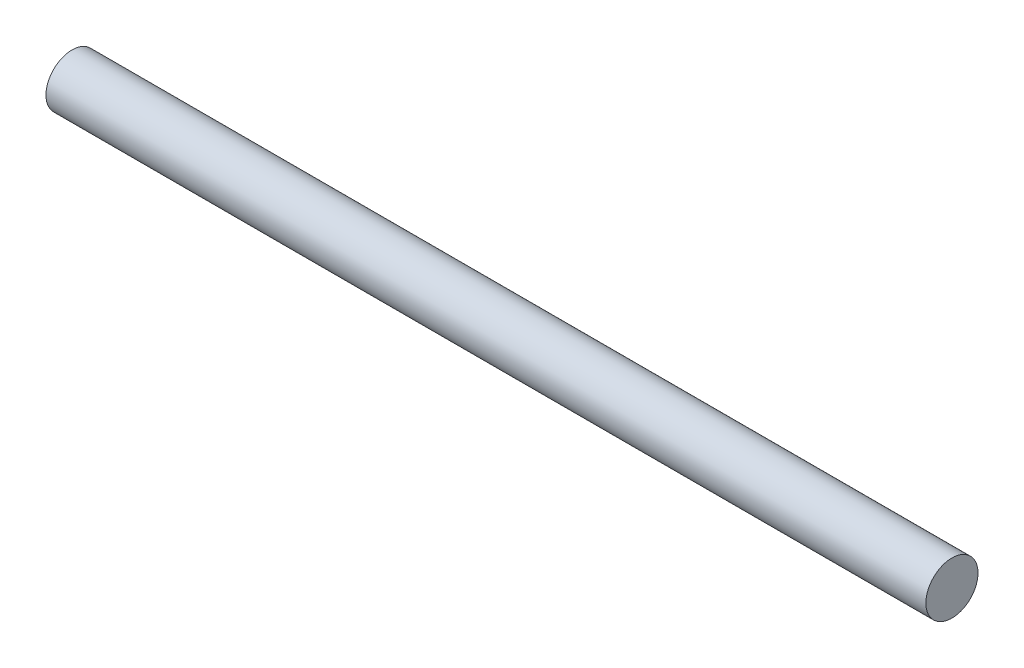
ISO-10303-21;
HEADER;
FILE_DESCRIPTION(('STEP AP214'),'2;1');
FILE_NAME('part.step','',(''),(''),'','','');
FILE_SCHEMA(('AUTOMOTIVE_DESIGN { 1 0 10303 214 1 1 1 1 }'));
ENDSEC;
DATA;
#1=APPLICATION_CONTEXT('core data for automotive mechanical design processes');
#2=APPLICATION_PROTOCOL_DEFINITION('international standard','automotive_design',2000,#1);
#3=PRODUCT_CONTEXT('',#1,'mechanical');
#4=PRODUCT('Part','Part','',(#3));
#5=PRODUCT_RELATED_PRODUCT_CATEGORY('part','',(#4));
#6=PRODUCT_DEFINITION_FORMATION('','',#4);
#7=PRODUCT_DEFINITION_CONTEXT('part definition',#1,'design');
#8=PRODUCT_DEFINITION('design','',#6,#7);
#9=PRODUCT_DEFINITION_SHAPE('','',#8);
#10=(LENGTH_UNIT() NAMED_UNIT(*) SI_UNIT(.MILLI.,.METRE.));
#11=(NAMED_UNIT(*) PLANE_ANGLE_UNIT() SI_UNIT($,.RADIAN.));
#12=(NAMED_UNIT(*) SI_UNIT($,.STERADIAN.) SOLID_ANGLE_UNIT());
#13=UNCERTAINTY_MEASURE_WITH_UNIT(LENGTH_MEASURE(1.E-05),#10,'distance_accuracy_value','');
#14=(GEOMETRIC_REPRESENTATION_CONTEXT(3) GLOBAL_UNCERTAINTY_ASSIGNED_CONTEXT((#13)) GLOBAL_UNIT_ASSIGNED_CONTEXT((#10,
#11,#12)) REPRESENTATION_CONTEXT('',''));
#15=CARTESIAN_POINT('',(0.,0.,0.));
#16=DIRECTION('',(0.,0.,1.));
#17=DIRECTION('',(1.,0.,0.));
#18=AXIS2_PLACEMENT_3D('',#15,#16,#17);
#19=CARTESIAN_POINT('',(135.,0.,0.));
#20=DIRECTION('',(-1.,0.,0.));
#21=DIRECTION('',(0.,0.,1.));
#22=AXIS2_PLACEMENT_3D('',#19,#20,#21);
#23=CYLINDRICAL_SURFACE('',#22,4.);
#24=CARTESIAN_POINT('',(135.,0.,0.));
#25=DIRECTION('',(1.,0.,0.));
#26=DIRECTION('',(0.,0.,-1.));
#27=AXIS2_PLACEMENT_3D('',#24,#25,#26);
#28=CIRCLE('',#27,4.);
#29=CARTESIAN_POINT('',(135.,0.,-4.));
#30=VERTEX_POINT('',#29);
#31=EDGE_CURVE('E10',#30,#30,#28,.T.);
#32=ORIENTED_EDGE('',*,*,#31,.F.);
#33=EDGE_LOOP('',(#32));
#34=FACE_BOUND('',#33,.T.);
#35=CARTESIAN_POINT('',(0.,0.,0.));
#36=DIRECTION('',(1.,0.,0.));
#37=DIRECTION('',(0.,0.,-1.));
#38=AXIS2_PLACEMENT_3D('',#35,#36,#37);
#39=CIRCLE('',#38,4.);
#40=CARTESIAN_POINT('',(0.,0.,-4.));
#41=VERTEX_POINT('',#40);
#42=EDGE_CURVE('E34',#41,#41,#39,.T.);
#43=ORIENTED_EDGE('',*,*,#42,.T.);
#44=EDGE_LOOP('',(#43));
#45=FACE_BOUND('',#44,.T.);
#46=ADVANCED_FACE('F31',(#34,#45),#23,.T.);
#47=CARTESIAN_POINT('',(135.,0.,0.));
#48=DIRECTION('',(1.,0.,0.));
#49=DIRECTION('',(0.,0.,-1.));
#50=AXIS2_PLACEMENT_3D('',#47,#48,#49);
#51=PLANE('',#50);
#52=ORIENTED_EDGE('',*,*,#31,.T.);
#53=EDGE_LOOP('',(#52));
#54=FACE_BOUND('',#53,.T.);
#55=ADVANCED_FACE('F46',(#54),#51,.T.);
#56=CARTESIAN_POINT('',(0.,0.,0.));
#57=DIRECTION('',(1.,0.,0.));
#58=DIRECTION('',(0.,0.,-1.));
#59=AXIS2_PLACEMENT_3D('',#56,#57,#58);
#60=PLANE('',#59);
#61=ORIENTED_EDGE('',*,*,#42,.F.);
#62=EDGE_LOOP('',(#61));
#63=FACE_BOUND('',#62,.T.);
#64=ADVANCED_FACE('F44',(#63),#60,.F.);
#65=CLOSED_SHELL('',(#46,#55,#64));
#66=MANIFOLD_SOLID_BREP('B2',#65);
#67=ADVANCED_BREP_SHAPE_REPRESENTATION('',(#18,#66),#14);
#68=SHAPE_DEFINITION_REPRESENTATION(#9,#67);
ENDSEC;
END-ISO-10303-21;
